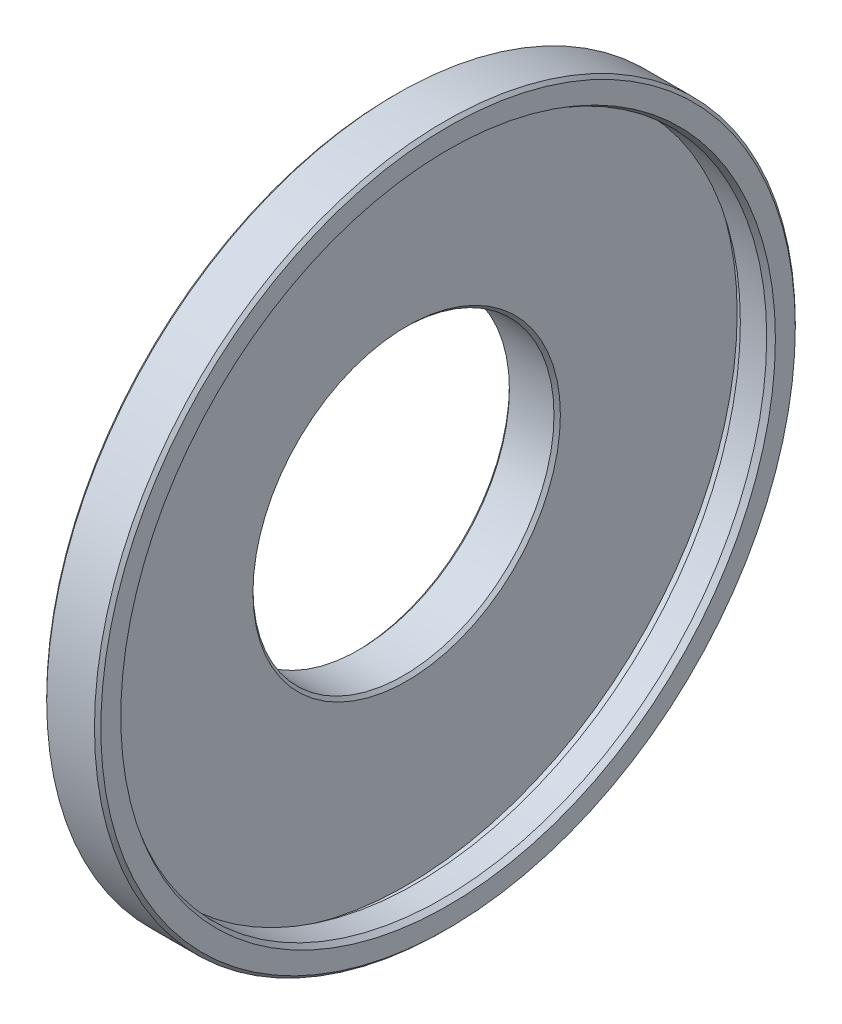
ISO-10303-21;
HEADER;
FILE_DESCRIPTION(('STEP AP214'),'2;1');
FILE_NAME('part.step','',(''),(''),'','','');
FILE_SCHEMA(('AUTOMOTIVE_DESIGN { 1 0 10303 214 1 1 1 1 }'));
ENDSEC;
DATA;
#1=APPLICATION_CONTEXT('core data for automotive mechanical design processes');
#2=APPLICATION_PROTOCOL_DEFINITION('international standard','automotive_design',2000,#1);
#3=PRODUCT_CONTEXT('',#1,'mechanical');
#4=PRODUCT('Part','Part','',(#3));
#5=PRODUCT_RELATED_PRODUCT_CATEGORY('part','',(#4));
#6=PRODUCT_DEFINITION_FORMATION('','',#4);
#7=PRODUCT_DEFINITION_CONTEXT('part definition',#1,'design');
#8=PRODUCT_DEFINITION('design','',#6,#7);
#9=PRODUCT_DEFINITION_SHAPE('','',#8);
#10=(LENGTH_UNIT() NAMED_UNIT(*) SI_UNIT(.MILLI.,.METRE.));
#11=(NAMED_UNIT(*) PLANE_ANGLE_UNIT() SI_UNIT($,.RADIAN.));
#12=(NAMED_UNIT(*) SI_UNIT($,.STERADIAN.) SOLID_ANGLE_UNIT());
#13=UNCERTAINTY_MEASURE_WITH_UNIT(LENGTH_MEASURE(1.E-05),#10,'distance_accuracy_value','');
#14=(GEOMETRIC_REPRESENTATION_CONTEXT(3) GLOBAL_UNCERTAINTY_ASSIGNED_CONTEXT((#13)) GLOBAL_UNIT_ASSIGNED_CONTEXT((#10,
#11,#12)) REPRESENTATION_CONTEXT('',''));
#15=CARTESIAN_POINT('',(0.,0.,0.));
#16=DIRECTION('',(0.,0.,1.));
#17=DIRECTION('',(1.,0.,0.));
#18=AXIS2_PLACEMENT_3D('',#15,#16,#17);
#19=CARTESIAN_POINT('',(0.,27.94,0.));
#20=DIRECTION('',(1.,0.,0.));
#21=DIRECTION('',(0.,0.,-1.));
#22=AXIS2_PLACEMENT_3D('',#19,#20,#21);
#23=PLANE('',#22);
#24=CARTESIAN_POINT('',(0.,0.,0.));
#25=DIRECTION('',(1.,0.,0.));
#26=DIRECTION('',(0.,0.,-1.));
#27=AXIS2_PLACEMENT_3D('',#24,#25,#26);
#28=CIRCLE('',#27,27.686);
#29=CARTESIAN_POINT('',(0.,0.,-27.686));
#30=VERTEX_POINT('',#29);
#31=EDGE_CURVE('E37',#30,#30,#28,.T.);
#32=ORIENTED_EDGE('',*,*,#31,.T.);
#33=EDGE_LOOP('',(#32));
#34=FACE_BOUND('',#33,.T.);
#35=CARTESIAN_POINT('',(0.,0.,0.));
#36=DIRECTION('',(1.,0.,0.));
#37=DIRECTION('',(0.,0.,-1.));
#38=AXIS2_PLACEMENT_3D('',#35,#36,#37);
#39=CIRCLE('',#38,26.0985);
#40=CARTESIAN_POINT('',(0.,0.,-26.0985));
#41=VERTEX_POINT('',#40);
#42=EDGE_CURVE('E49',#41,#41,#39,.F.);
#43=ORIENTED_EDGE('',*,*,#42,.T.);
#44=EDGE_LOOP('',(#43));
#45=FACE_BOUND('',#44,.T.);
#46=ADVANCED_FACE('F17',(#34,#45),#23,.T.);
#47=CARTESIAN_POINT('',(0.,0.,0.));
#48=DIRECTION('',(1.,0.,0.));
#49=DIRECTION('',(0.,0.,-1.));
#50=AXIS2_PLACEMENT_3D('',#47,#48,#49);
#51=CYLINDRICAL_SURFACE('',#50,27.94);
#52=CARTESIAN_POINT('',(-0.254000000000001,0.,0.));
#53=DIRECTION('',(1.,0.,0.));
#54=DIRECTION('',(0.,0.,-1.));
#55=AXIS2_PLACEMENT_3D('',#52,#53,#54);
#56=CIRCLE('',#55,27.94);
#57=CARTESIAN_POINT('',(-0.254000000000001,0.,-27.94));
#58=VERTEX_POINT('',#57);
#59=EDGE_CURVE('E28',#58,#58,#56,.F.);
#60=ORIENTED_EDGE('',*,*,#59,.T.);
#61=EDGE_LOOP('',(#60));
#62=FACE_BOUND('',#61,.T.);
#63=CARTESIAN_POINT('',(-4.064,0.,0.));
#64=DIRECTION('',(-1.,0.,0.));
#65=DIRECTION('',(0.,0.,1.));
#66=AXIS2_PLACEMENT_3D('',#63,#64,#65);
#67=CIRCLE('',#66,27.94);
#68=CARTESIAN_POINT('',(-4.064,0.,27.94));
#69=VERTEX_POINT('',#68);
#70=EDGE_CURVE('E32',#69,#69,#67,.F.);
#71=ORIENTED_EDGE('',*,*,#70,.T.);
#72=EDGE_LOOP('',(#71));
#73=FACE_BOUND('',#72,.T.);
#74=ADVANCED_FACE('F99',(#62,#73),#51,.T.);
#75=CARTESIAN_POINT('',(-4.318,27.94,0.));
#76=DIRECTION('',(-1.,0.,0.));
#77=DIRECTION('',(0.,0.,1.));
#78=AXIS2_PLACEMENT_3D('',#75,#76,#77);
#79=PLANE('',#78);
#80=CARTESIAN_POINT('',(-4.318,0.,0.));
#81=DIRECTION('',(-1.,0.,0.));
#82=DIRECTION('',(0.,0.,1.));
#83=AXIS2_PLACEMENT_3D('',#80,#81,#82);
#84=CIRCLE('',#83,27.686);
#85=CARTESIAN_POINT('',(-4.318,0.,27.686));
#86=VERTEX_POINT('',#85);
#87=EDGE_CURVE('E24',#86,#86,#84,.T.);
#88=ORIENTED_EDGE('',*,*,#87,.T.);
#89=EDGE_LOOP('',(#88));
#90=FACE_BOUND('',#89,.T.);
#91=CARTESIAN_POINT('',(-4.318,0.,0.));
#92=DIRECTION('',(1.,0.,0.));
#93=DIRECTION('',(0.,0.,-1.));
#94=AXIS2_PLACEMENT_3D('',#91,#92,#93);
#95=CIRCLE('',#94,12.6873);
#96=CARTESIAN_POINT('',(-4.318,0.,-12.6873));
#97=VERTEX_POINT('',#96);
#98=EDGE_CURVE('E61',#97,#97,#95,.T.);
#99=ORIENTED_EDGE('',*,*,#98,.T.);
#100=EDGE_LOOP('',(#99));
#101=FACE_BOUND('',#100,.T.);
#102=ADVANCED_FACE('F105',(#90,#101),#79,.T.);
#103=CARTESIAN_POINT('',(0.,0.,0.));
#104=DIRECTION('',(1.,0.,0.));
#105=DIRECTION('',(0.,0.,-1.));
#106=AXIS2_PLACEMENT_3D('',#103,#104,#105);
#107=CYLINDRICAL_SURFACE('',#106,12.6873);
#108=CARTESIAN_POINT('',(-5.08,0.,0.));
#109=DIRECTION('',(1.,0.,0.));
#110=DIRECTION('',(0.,0.,-1.));
#111=AXIS2_PLACEMENT_3D('',#108,#109,#110);
#112=CIRCLE('',#111,12.6873);
#113=CARTESIAN_POINT('',(-5.08,0.,-12.6873));
#114=VERTEX_POINT('',#113);
#115=EDGE_CURVE('E64',#114,#114,#112,.T.);
#116=ORIENTED_EDGE('',*,*,#115,.T.);
#117=EDGE_LOOP('',(#116));
#118=FACE_BOUND('',#117,.T.);
#119=ORIENTED_EDGE('',*,*,#98,.F.);
#120=EDGE_LOOP('',(#119));
#121=FACE_BOUND('',#120,.T.);
#122=ADVANCED_FACE('F158',(#118,#121),#107,.T.);
#123=CARTESIAN_POINT('',(-5.08,0.,0.));
#124=DIRECTION('',(-1.,0.,0.));
#125=DIRECTION('',(0.,0.,1.));
#126=AXIS2_PLACEMENT_3D('',#123,#124,#125);
#127=CONICAL_SURFACE('',#126,12.6873,1.0471975511966);
#128=CARTESIAN_POINT('',(-5.34396454307349,0.,0.));
#129=DIRECTION('',(1.,0.,0.));
#130=DIRECTION('',(0.,0.,-1.));
#131=AXIS2_PLACEMENT_3D('',#128,#129,#130);
#132=CIRCLE('',#131,13.1445);
#133=CARTESIAN_POINT('',(-5.34396454307349,0.,-13.1445));
#134=VERTEX_POINT('',#133);
#135=EDGE_CURVE('E67',#134,#134,#132,.T.);
#136=ORIENTED_EDGE('',*,*,#135,.T.);
#137=EDGE_LOOP('',(#136));
#138=FACE_BOUND('',#137,.T.);
#139=ORIENTED_EDGE('',*,*,#115,.F.);
#140=EDGE_LOOP('',(#139));
#141=FACE_BOUND('',#140,.T.);
#142=ADVANCED_FACE('F154',(#138,#141),#127,.T.);
#143=CARTESIAN_POINT('',(0.,0.,0.));
#144=DIRECTION('',(1.,0.,0.));
#145=DIRECTION('',(0.,0.,-1.));
#146=AXIS2_PLACEMENT_3D('',#143,#144,#145);
#147=CYLINDRICAL_SURFACE('',#146,13.1445);
#148=CARTESIAN_POINT('',(-6.92605909487752,0.,0.));
#149=DIRECTION('',(-1.,0.,0.));
#150=DIRECTION('',(0.,0.,1.));
#151=AXIS2_PLACEMENT_3D('',#148,#149,#150);
#152=CIRCLE('',#151,13.1445);
#153=CARTESIAN_POINT('',(-6.92605909487752,0.,-13.1445));
#154=VERTEX_POINT('',#153);
#155=EDGE_CURVE('E58',#154,#154,#152,.F.);
#156=ORIENTED_EDGE('',*,*,#155,.T.);
#157=EDGE_LOOP('',(#156));
#158=FACE_BOUND('',#157,.T.);
#159=ORIENTED_EDGE('',*,*,#135,.F.);
#160=EDGE_LOOP('',(#159));
#161=FACE_BOUND('',#160,.T.);
#162=ADVANCED_FACE('F148',(#158,#161),#147,.T.);
#163=CARTESIAN_POINT('',(-7.366,13.1445,0.));
#164=DIRECTION('',(-1.,0.,0.));
#165=DIRECTION('',(0.,0.,1.));
#166=AXIS2_PLACEMENT_3D('',#163,#164,#165);
#167=PLANE('',#166);
#168=CARTESIAN_POINT('',(-7.366,0.,0.));
#169=DIRECTION('',(-1.,0.,0.));
#170=DIRECTION('',(0.,0.,1.));
#171=AXIS2_PLACEMENT_3D('',#168,#169,#170);
#172=CIRCLE('',#171,12.2555);
#173=CARTESIAN_POINT('',(-7.366,0.,12.2555));
#174=VERTEX_POINT('',#173);
#175=EDGE_CURVE('E10',#174,#174,#172,.F.);
#176=ORIENTED_EDGE('',*,*,#175,.T.);
#177=EDGE_LOOP('',(#176));
#178=FACE_BOUND('',#177,.T.);
#179=CARTESIAN_POINT('',(-7.366,0.,0.));
#180=DIRECTION('',(-1.,0.,0.));
#181=DIRECTION('',(0.,0.,1.));
#182=AXIS2_PLACEMENT_3D('',#179,#180,#181);
#183=CIRCLE('',#182,12.8905);
#184=CARTESIAN_POINT('',(-7.366,0.,-12.8905));
#185=VERTEX_POINT('',#184);
#186=EDGE_CURVE('E55',#185,#185,#183,.T.);
#187=ORIENTED_EDGE('',*,*,#186,.T.);
#188=EDGE_LOOP('',(#187));
#189=FACE_BOUND('',#188,.T.);
#190=ADVANCED_FACE('F139',(#178,#189),#167,.T.);
#191=CARTESIAN_POINT('',(0.,0.,0.));
#192=DIRECTION('',(1.,0.,0.));
#193=DIRECTION('',(0.,0.,-1.));
#194=AXIS2_PLACEMENT_3D('',#191,#192,#193);
#195=CYLINDRICAL_SURFACE('',#194,12.0015);
#196=CARTESIAN_POINT('',(-3.556,0.,0.));
#197=DIRECTION('',(1.,0.,0.));
#198=DIRECTION('',(0.,0.,-1.));
#199=AXIS2_PLACEMENT_3D('',#196,#197,#198);
#200=CIRCLE('',#199,12.0015);
#201=CARTESIAN_POINT('',(-3.556,0.,-12.0015));
#202=VERTEX_POINT('',#201);
#203=EDGE_CURVE('E43',#202,#202,#200,.T.);
#204=ORIENTED_EDGE('',*,*,#203,.T.);
#205=EDGE_LOOP('',(#204));
#206=FACE_BOUND('',#205,.T.);
#207=CARTESIAN_POINT('',(-7.11199999999999,0.,0.));
#208=DIRECTION('',(-1.,0.,0.));
#209=DIRECTION('',(0.,0.,1.));
#210=AXIS2_PLACEMENT_3D('',#207,#208,#209);
#211=CIRCLE('',#210,12.0015);
#212=CARTESIAN_POINT('',(-7.11199999999999,0.,12.0015));
#213=VERTEX_POINT('',#212);
#214=EDGE_CURVE('E46',#213,#213,#211,.T.);
#215=ORIENTED_EDGE('',*,*,#214,.T.);
#216=EDGE_LOOP('',(#215));
#217=FACE_BOUND('',#216,.T.);
#218=ADVANCED_FACE('F136',(#206,#217),#195,.F.);
#219=CARTESIAN_POINT('',(-3.302,12.0015,0.));
#220=DIRECTION('',(1.,0.,0.));
#221=DIRECTION('',(0.,0.,-1.));
#222=AXIS2_PLACEMENT_3D('',#219,#220,#221);
#223=PLANE('',#222);
#224=CARTESIAN_POINT('',(-3.302,0.,0.));
#225=DIRECTION('',(1.,0.,0.));
#226=DIRECTION('',(0.,0.,-1.));
#227=AXIS2_PLACEMENT_3D('',#224,#225,#226);
#228=CIRCLE('',#227,12.2555);
#229=CARTESIAN_POINT('',(-3.302,0.,-12.2555));
#230=VERTEX_POINT('',#229);
#231=EDGE_CURVE('E40',#230,#230,#228,.F.);
#232=ORIENTED_EDGE('',*,*,#231,.T.);
#233=EDGE_LOOP('',(#232));
#234=FACE_BOUND('',#233,.T.);
#235=CARTESIAN_POINT('',(-3.302,0.,0.));
#236=DIRECTION('',(1.,0.,0.));
#237=DIRECTION('',(0.,0.,-1.));
#238=AXIS2_PLACEMENT_3D('',#235,#236,#237);
#239=CIRCLE('',#238,26.3525);
#240=CARTESIAN_POINT('',(-3.302,0.,-26.3525));
#241=VERTEX_POINT('',#240);
#242=EDGE_CURVE('E70',#241,#241,#239,.T.);
#243=ORIENTED_EDGE('',*,*,#242,.T.);
#244=EDGE_LOOP('',(#243));
#245=FACE_BOUND('',#244,.T.);
#246=ADVANCED_FACE('F138',(#234,#245),#223,.T.);
#247=CARTESIAN_POINT('',(0.,0.,0.));
#248=DIRECTION('',(1.,0.,0.));
#249=DIRECTION('',(0.,0.,-1.));
#250=AXIS2_PLACEMENT_3D('',#247,#248,#249);
#251=CYLINDRICAL_SURFACE('',#250,26.3525);
#252=CARTESIAN_POINT('',(-2.54,0.,0.));
#253=DIRECTION('',(1.,0.,0.));
#254=DIRECTION('',(0.,0.,-1.));
#255=AXIS2_PLACEMENT_3D('',#252,#253,#254);
#256=CIRCLE('',#255,26.3525);
#257=CARTESIAN_POINT('',(-2.54,0.,-26.3525));
#258=VERTEX_POINT('',#257);
#259=EDGE_CURVE('E73',#258,#258,#256,.T.);
#260=ORIENTED_EDGE('',*,*,#259,.T.);
#261=EDGE_LOOP('',(#260));
#262=FACE_BOUND('',#261,.T.);
#263=ORIENTED_EDGE('',*,*,#242,.F.);
#264=EDGE_LOOP('',(#263));
#265=FACE_BOUND('',#264,.T.);
#266=ADVANCED_FACE('F96',(#262,#265),#251,.F.);
#267=CARTESIAN_POINT('',(-2.54,26.3525,0.));
#268=DIRECTION('',(-1.,0.,0.));
#269=DIRECTION('',(0.,0.,1.));
#270=AXIS2_PLACEMENT_3D('',#267,#268,#269);
#271=PLANE('',#270);
#272=CARTESIAN_POINT('',(-2.54,0.,0.));
#273=DIRECTION('',(1.,0.,0.));
#274=DIRECTION('',(0.,0.,-1.));
#275=AXIS2_PLACEMENT_3D('',#272,#273,#274);
#276=CIRCLE('',#275,25.8445);
#277=CARTESIAN_POINT('',(-2.54,0.,-25.8445));
#278=VERTEX_POINT('',#277);
#279=EDGE_CURVE('E76',#278,#278,#276,.T.);
#280=ORIENTED_EDGE('',*,*,#279,.T.);
#281=EDGE_LOOP('',(#280));
#282=FACE_BOUND('',#281,.T.);
#283=ORIENTED_EDGE('',*,*,#259,.F.);
#284=EDGE_LOOP('',(#283));
#285=FACE_BOUND('',#284,.T.);
#286=ADVANCED_FACE('F80',(#282,#285),#271,.T.);
#287=CARTESIAN_POINT('',(0.,0.,0.));
#288=DIRECTION('',(1.,0.,0.));
#289=DIRECTION('',(0.,0.,-1.));
#290=AXIS2_PLACEMENT_3D('',#287,#288,#289);
#291=CYLINDRICAL_SURFACE('',#290,25.8445);
#292=CARTESIAN_POINT('',(-0.439940905122456,0.,0.));
#293=DIRECTION('',(1.,0.,0.));
#294=DIRECTION('',(0.,0.,-1.));
#295=AXIS2_PLACEMENT_3D('',#292,#293,#294);
#296=CIRCLE('',#295,25.8445);
#297=CARTESIAN_POINT('',(-0.439940905122456,0.,-25.8445));
#298=VERTEX_POINT('',#297);
#299=EDGE_CURVE('E52',#298,#298,#296,.T.);
#300=ORIENTED_EDGE('',*,*,#299,.T.);
#301=EDGE_LOOP('',(#300));
#302=FACE_BOUND('',#301,.T.);
#303=ORIENTED_EDGE('',*,*,#279,.F.);
#304=EDGE_LOOP('',(#303));
#305=FACE_BOUND('',#304,.T.);
#306=ADVANCED_FACE('F83',(#302,#305),#291,.F.);
#307=CARTESIAN_POINT('',(-6.92605909487752,0.,0.));
#308=DIRECTION('',(1.,0.,0.));
#309=DIRECTION('',(0.,0.,-1.));
#310=AXIS2_PLACEMENT_3D('',#307,#308,#309);
#311=CONICAL_SURFACE('',#310,13.1445,0.523598775598309);
#312=CARTESIAN_POINT('',(-7.366,0.,-12.8905));
#313=CARTESIAN_POINT('',(-7.36141728223831,0.,-12.8931458333333));
#314=CARTESIAN_POINT('',(-7.35683456447662,0.,-12.8957916666667));
#315=CARTESIAN_POINT('',(-7.34766912895323,0.,-12.9010833333333));
#316=CARTESIAN_POINT('',(-7.34308641119154,0.,-12.9037291666667));
#317=CARTESIAN_POINT('',(-7.33392097566815,0.,-12.9090208333333));
#318=CARTESIAN_POINT('',(-7.32933825790646,0.,-12.9116666666667));
#319=CARTESIAN_POINT('',(-7.32017282238308,0.,-12.9169583333333));
#320=CARTESIAN_POINT('',(-7.31559010462138,0.,-12.9196041666667));
#321=CARTESIAN_POINT('',(-7.306424669098,0.,-12.9248958333333));
#322=CARTESIAN_POINT('',(-7.30184195133631,0.,-12.9275416666667));
#323=CARTESIAN_POINT('',(-7.29267651581292,0.,-12.9328333333333));
#324=CARTESIAN_POINT('',(-7.28809379805123,0.,-12.9354791666667));
#325=CARTESIAN_POINT('',(-7.27892836252784,0.,-12.9407708333333));
#326=CARTESIAN_POINT('',(-7.27434564476615,0.,-12.9434166666667));
#327=CARTESIAN_POINT('',(-7.26518020924277,0.,-12.9487083333333));
#328=CARTESIAN_POINT('',(-7.26059749148107,0.,-12.9513541666667));
#329=CARTESIAN_POINT('',(-7.25143205595769,0.,-12.9566458333333));
#330=CARTESIAN_POINT('',(-7.246849338196,0.,-12.9592916666667));
#331=CARTESIAN_POINT('',(-7.23768390267261,0.,-12.9645833333333));
#332=CARTESIAN_POINT('',(-7.23310118491092,0.,-12.9672291666667));
#333=CARTESIAN_POINT('',(-7.22393574938753,0.,-12.9725208333333));
#334=CARTESIAN_POINT('',(-7.21935303162584,0.,-12.9751666666667));
#335=CARTESIAN_POINT('',(-7.21018759610246,0.,-12.9804583333333));
#336=CARTESIAN_POINT('',(-7.20560487834076,0.,-12.9831041666667));
#337=CARTESIAN_POINT('',(-7.19643944281738,0.,-12.9883958333333));
#338=CARTESIAN_POINT('',(-7.19185672505569,0.,-12.9910416666667));
#339=CARTESIAN_POINT('',(-7.1826912895323,0.,-12.9963333333333));
#340=CARTESIAN_POINT('',(-7.17810857177061,0.,-12.9989791666667));
#341=CARTESIAN_POINT('',(-7.16894313624722,0.,-13.0042708333333));
#342=CARTESIAN_POINT('',(-7.16436041848553,0.,-13.0069166666667));
#343=CARTESIAN_POINT('',(-7.15519498296215,0.,-13.0122083333333));
#344=CARTESIAN_POINT('',(-7.15061226520045,0.,-13.0148541666667));
#345=CARTESIAN_POINT('',(-7.14144682967707,0.,-13.0201458333333));
#346=CARTESIAN_POINT('',(-7.13686411191538,0.,-13.0227916666667));
#347=CARTESIAN_POINT('',(-7.12769867639199,0.,-13.0280833333333));
#348=CARTESIAN_POINT('',(-7.1231159586303,0.,-13.0307291666667));
#349=CARTESIAN_POINT('',(-7.11395052310691,0.,-13.0360208333333));
#350=CARTESIAN_POINT('',(-7.10936780534522,0.,-13.0386666666667));
#351=CARTESIAN_POINT('',(-7.10020236982184,0.,-13.0439583333333));
#352=CARTESIAN_POINT('',(-7.09561965206014,0.,-13.0466041666667));
#353=CARTESIAN_POINT('',(-7.08645421653676,0.,-13.0518958333333));
#354=CARTESIAN_POINT('',(-7.08187149877507,0.,-13.0545416666667));
#355=CARTESIAN_POINT('',(-7.07270606325168,0.,-13.0598333333333));
#356=CARTESIAN_POINT('',(-7.06812334548999,0.,-13.0624791666667));
#357=CARTESIAN_POINT('',(-7.0589579099666,0.,-13.0677708333333));
#358=CARTESIAN_POINT('',(-7.05437519220491,0.,-13.0704166666667));
#359=CARTESIAN_POINT('',(-7.04520975668153,0.,-13.0757083333333));
#360=CARTESIAN_POINT('',(-7.04062703891983,0.,-13.0783541666667));
#361=CARTESIAN_POINT('',(-7.03146160339645,0.,-13.0836458333333));
#362=CARTESIAN_POINT('',(-7.02687888563476,0.,-13.0862916666667));
#363=CARTESIAN_POINT('',(-7.01771345011137,0.,-13.0915833333333));
#364=CARTESIAN_POINT('',(-7.01313073234968,0.,-13.0942291666667));
#365=CARTESIAN_POINT('',(-7.00396529682629,0.,-13.0995208333333));
#366=CARTESIAN_POINT('',(-6.9993825790646,0.,-13.1021666666667));
#367=CARTESIAN_POINT('',(-6.99021714354122,0.,-13.1074583333333));
#368=CARTESIAN_POINT('',(-6.98563442577952,0.,-13.1101041666667));
#369=CARTESIAN_POINT('',(-6.97646899025614,0.,-13.1153958333333));
#370=CARTESIAN_POINT('',(-6.97188627249445,0.,-13.1180416666667));
#371=CARTESIAN_POINT('',(-6.96272083697106,0.,-13.1233333333333));
#372=CARTESIAN_POINT('',(-6.95813811920937,0.,-13.1259791666667));
#373=CARTESIAN_POINT('',(-6.94897268368598,0.,-13.1312708333333));
#374=CARTESIAN_POINT('',(-6.94438996592429,0.,-13.1339166666667));
#375=CARTESIAN_POINT('',(-6.93522453040091,0.,-13.1392083333333));
#376=CARTESIAN_POINT('',(-6.93064181263921,0.,-13.1418541666667));
#377=CARTESIAN_POINT('',(-6.92605909487752,0.,-13.1445));
#378=B_SPLINE_CURVE_WITH_KNOTS('',3,(#312,#313,#314,#315,#316,#317,#318,#319,#320,#321,#322,
#323,#324,#325,#326,#327,#328,#329,#330,#331,#332,#333,#334,#335,#336,#337,#338,#339,#340,#341,
#342,#343,#344,#345,#346,#347,#348,#349,#350,#351,#352,#353,#354,#355,#356,#357,#358,#359,#360,
#361,#362,#363,#364,#365,#366,#367,#368,#369,#370,#371,#372,#373,#374,#375,#376,#377),
.UNSPECIFIED.,.F.,.F.,(4,2,2,2,2,2,2,2,2,2,2,2,2,2,2,2,2,2,2,2,2,2,2,2,2,2,2,2,2,2,2,2,4),(0.,
0.0158749999999999,0.0317499999999999,0.047624999999999,0.063499999999999,0.0793749999999982,
0.0952499999999973,0.111124999999997,0.126999999999996,0.142874999999996,0.158749999999996,
0.174624999999996,0.190499999999996,0.206374999999995,0.222249999999994,0.238124999999994,
0.253999999999993,0.269874999999993,0.285749999999993,0.301624999999992,0.317499999999992,
0.333374999999991,0.34924999999999,0.36512499999999,0.38099999999999,0.39687499999999,
0.412749999999989,0.428624999999988,0.444499999999988,0.460374999999987,0.476249999999987,
0.492124999999987,0.507999999999986),.UNSPECIFIED.);
#379=EDGE_CURVE('BSEAM85',#185,#154,#378,.T.);
#380=ORIENTED_EDGE('',*,*,#186,.F.);
#381=ORIENTED_EDGE('',*,*,#155,.F.);
#382=ORIENTED_EDGE('',*,*,#379,.T.);
#383=ORIENTED_EDGE('',*,*,#379,.F.);
#384=EDGE_LOOP('',(#380,#382,#381,#383));
#385=FACE_BOUND('',#384,.T.);
#386=ADVANCED_FACE('F85',(#385),#311,.T.);
#387=CARTESIAN_POINT('',(-0.439940905122456,0.,0.));
#388=DIRECTION('',(1.,0.,0.));
#389=DIRECTION('',(0.,0.,-1.));
#390=AXIS2_PLACEMENT_3D('',#387,#388,#389);
#391=CONICAL_SURFACE('',#390,25.8445,0.523598775598297);
#392=CARTESIAN_POINT('',(0.,0.,-26.0985));
#393=CARTESIAN_POINT('',(-0.00458271776169268,0.,-26.0958541666666));
#394=CARTESIAN_POINT('',(-0.00916543552338493,0.,-26.0932083333333));
#395=CARTESIAN_POINT('',(-0.0183308710467694,0.,-26.0879166666666));
#396=CARTESIAN_POINT('',(-0.0229135888084617,0.,-26.0852708333333));
#397=CARTESIAN_POINT('',(-0.0320790243318462,0.,-26.0799791666666));
#398=CARTESIAN_POINT('',(-0.0366617420935384,0.,-26.0773333333333));
#399=CARTESIAN_POINT('',(-0.0458271776169229,0.,-26.0720416666666));
#400=CARTESIAN_POINT('',(-0.0504098953786152,0.,-26.0693958333333));
#401=CARTESIAN_POINT('',(-0.0595753309019997,0.,-26.0641041666666));
#402=CARTESIAN_POINT('',(-0.0641580486636919,0.,-26.0614583333333));
#403=CARTESIAN_POINT('',(-0.0733234841870764,0.,-26.0561666666666));
#404=CARTESIAN_POINT('',(-0.0779062019487687,0.,-26.0535208333333));
#405=CARTESIAN_POINT('',(-0.0870716374721532,0.,-26.0482291666666));
#406=CARTESIAN_POINT('',(-0.0916543552338454,0.,-26.0455833333333));
#407=CARTESIAN_POINT('',(-0.10081979075723,0.,-26.0402916666667));
#408=CARTESIAN_POINT('',(-0.105402508518922,0.,-26.0376458333333));
#409=CARTESIAN_POINT('',(-0.114567944042307,0.,-26.0323541666667));
#410=CARTESIAN_POINT('',(-0.119150661803999,0.,-26.0297083333333));
#411=CARTESIAN_POINT('',(-0.128316097327383,0.,-26.0244166666666));
#412=CARTESIAN_POINT('',(-0.132898815089076,0.,-26.0217708333333));
#413=CARTESIAN_POINT('',(-0.14206425061246,0.,-26.0164791666667));
#414=CARTESIAN_POINT('',(-0.146646968374152,0.,-26.0138333333333));
#415=CARTESIAN_POINT('',(-0.155812403897537,0.,-26.0085416666667));
#416=CARTESIAN_POINT('',(-0.160395121659229,0.,-26.0058958333333));
#417=CARTESIAN_POINT('',(-0.169560557182614,0.,-26.0006041666667));
#418=CARTESIAN_POINT('',(-0.174143274944306,0.,-25.9979583333333));
#419=CARTESIAN_POINT('',(-0.18330871046769,0.,-25.9926666666667));
#420=CARTESIAN_POINT('',(-0.187891428229383,0.,-25.9900208333333));
#421=CARTESIAN_POINT('',(-0.197056863752767,0.,-25.9847291666667));
#422=CARTESIAN_POINT('',(-0.201639581514459,0.,-25.9820833333333));
#423=CARTESIAN_POINT('',(-0.210805017037844,0.,-25.9767916666667));
#424=CARTESIAN_POINT('',(-0.215387734799536,0.,-25.9741458333333));
#425=CARTESIAN_POINT('',(-0.224553170322921,0.,-25.9688541666667));
#426=CARTESIAN_POINT('',(-0.229135888084613,0.,-25.9662083333333));
#427=CARTESIAN_POINT('',(-0.238301323607997,0.,-25.9609166666667));
#428=CARTESIAN_POINT('',(-0.24288404136969,0.,-25.9582708333333));
#429=CARTESIAN_POINT('',(-0.252049476893074,0.,-25.9529791666667));
#430=CARTESIAN_POINT('',(-0.256632194654766,0.,-25.9503333333333));
#431=CARTESIAN_POINT('',(-0.265797630178151,0.,-25.9450416666667));
#432=CARTESIAN_POINT('',(-0.270380347939843,0.,-25.9423958333333));
#433=CARTESIAN_POINT('',(-0.279545783463228,0.,-25.9371041666667));
#434=CARTESIAN_POINT('',(-0.28412850122492,0.,-25.9344583333333));
#435=CARTESIAN_POINT('',(-0.293293936748304,0.,-25.9291666666667));
#436=CARTESIAN_POINT('',(-0.297876654509997,0.,-25.9265208333333));
#437=CARTESIAN_POINT('',(-0.307042090033381,0.,-25.9212291666667));
#438=CARTESIAN_POINT('',(-0.311624807795073,0.,-25.9185833333333));
#439=CARTESIAN_POINT('',(-0.320790243318458,0.,-25.9132916666667));
#440=CARTESIAN_POINT('',(-0.32537296108015,0.,-25.9106458333333));
#441=CARTESIAN_POINT('',(-0.334538396603535,0.,-25.9053541666667));
#442=CARTESIAN_POINT('',(-0.339121114365227,0.,-25.9027083333333));
#443=CARTESIAN_POINT('',(-0.348286549888611,0.,-25.8974166666667));
#444=CARTESIAN_POINT('',(-0.352869267650304,0.,-25.8947708333333));
#445=CARTESIAN_POINT('',(-0.362034703173688,0.,-25.8894791666667));
#446=CARTESIAN_POINT('',(-0.36661742093538,0.,-25.8868333333333));
#447=CARTESIAN_POINT('',(-0.375782856458765,0.,-25.8815416666667));
#448=CARTESIAN_POINT('',(-0.380365574220457,0.,-25.8788958333333));
#449=CARTESIAN_POINT('',(-0.389531009743842,0.,-25.8736041666667));
#450=CARTESIAN_POINT('',(-0.394113727505534,0.,-25.8709583333333));
#451=CARTESIAN_POINT('',(-0.403279163028918,0.,-25.8656666666667));
#452=CARTESIAN_POINT('',(-0.407861880790611,0.,-25.8630208333333));
#453=CARTESIAN_POINT('',(-0.417027316313995,0.,-25.8577291666667));
#454=CARTESIAN_POINT('',(-0.421610034075687,0.,-25.8550833333333));
#455=CARTESIAN_POINT('',(-0.430775469599072,0.,-25.8497916666667));
#456=CARTESIAN_POINT('',(-0.435358187360764,0.,-25.8471458333333));
#457=CARTESIAN_POINT('',(-0.439940905122456,0.,-25.8445));
#458=B_SPLINE_CURVE_WITH_KNOTS('',3,(#392,#393,#394,#395,#396,#397,#398,#399,#400,#401,#402,
#403,#404,#405,#406,#407,#408,#409,#410,#411,#412,#413,#414,#415,#416,#417,#418,#419,#420,#421,
#422,#423,#424,#425,#426,#427,#428,#429,#430,#431,#432,#433,#434,#435,#436,#437,#438,#439,#440,
#441,#442,#443,#444,#445,#446,#447,#448,#449,#450,#451,#452,#453,#454,#455,#456,#457),
.UNSPECIFIED.,.F.,.F.,(4,2,2,2,2,2,2,2,2,2,2,2,2,2,2,2,2,2,2,2,2,2,2,2,2,2,2,2,2,2,2,2,4),(0.,
0.0158749999999986,0.0317499999999972,0.0476249999999957,0.0634999999999943,0.0793749999999929,
0.0952499999999915,0.11112499999999,0.126999999999989,0.142874999999987,0.158749999999986,
0.174624999999984,0.190499999999983,0.206374999999982,0.22224999999998,0.238124999999979,
0.253999999999977,0.269874999999976,0.285749999999974,0.301624999999973,0.317499999999972,
0.33337499999997,0.349249999999969,0.365124999999967,0.380999999999966,0.396874999999965,
0.412749999999963,0.428624999999962,0.44449999999996,0.460374999999959,0.476249999999957,
0.492124999999956,0.507999999999955),.UNSPECIFIED.);
#459=EDGE_CURVE('BSEAM93',#41,#298,#458,.T.);
#460=ORIENTED_EDGE('',*,*,#42,.F.);
#461=ORIENTED_EDGE('',*,*,#299,.F.);
#462=ORIENTED_EDGE('',*,*,#459,.T.);
#463=ORIENTED_EDGE('',*,*,#459,.F.);
#464=EDGE_LOOP('',(#460,#462,#461,#463));
#465=FACE_BOUND('',#464,.T.);
#466=ADVANCED_FACE('F93',(#465),#391,.F.);
#467=CARTESIAN_POINT('',(-3.556,0.,0.));
#468=DIRECTION('',(1.,0.,0.));
#469=DIRECTION('',(0.,0.,-1.));
#470=AXIS2_PLACEMENT_3D('',#467,#468,#469);
#471=CONICAL_SURFACE('',#470,12.0015,0.785398163397448);
#472=ORIENTED_EDGE('',*,*,#231,.F.);
#473=EDGE_LOOP('',(#472));
#474=FACE_BOUND('',#473,.T.);
#475=ORIENTED_EDGE('',*,*,#203,.F.);
#476=EDGE_LOOP('',(#475));
#477=FACE_BOUND('',#476,.T.);
#478=ADVANCED_FACE('F113',(#474,#477),#471,.F.);
#479=CARTESIAN_POINT('',(0.,0.,0.));
#480=DIRECTION('',(-1.,0.,0.));
#481=DIRECTION('',(0.,0.,1.));
#482=AXIS2_PLACEMENT_3D('',#479,#480,#481);
#483=CONICAL_SURFACE('',#482,27.686,0.785398163397448);
#484=ORIENTED_EDGE('',*,*,#59,.F.);
#485=EDGE_LOOP('',(#484));
#486=FACE_BOUND('',#485,.T.);
#487=ORIENTED_EDGE('',*,*,#31,.F.);
#488=EDGE_LOOP('',(#487));
#489=FACE_BOUND('',#488,.T.);
#490=ADVANCED_FACE('F117',(#486,#489),#483,.T.);
#491=CARTESIAN_POINT('',(-4.064,0.,0.));
#492=DIRECTION('',(1.,0.,0.));
#493=DIRECTION('',(0.,0.,-1.));
#494=AXIS2_PLACEMENT_3D('',#491,#492,#493);
#495=CONICAL_SURFACE('',#494,27.94,0.785398163397448);
#496=ORIENTED_EDGE('',*,*,#87,.F.);
#497=EDGE_LOOP('',(#496));
#498=FACE_BOUND('',#497,.T.);
#499=ORIENTED_EDGE('',*,*,#70,.F.);
#500=EDGE_LOOP('',(#499));
#501=FACE_BOUND('',#500,.T.);
#502=ADVANCED_FACE('F120',(#498,#501),#495,.T.);
#503=CARTESIAN_POINT('',(-7.366,0.,0.));
#504=DIRECTION('',(-1.,0.,0.));
#505=DIRECTION('',(0.,0.,1.));
#506=AXIS2_PLACEMENT_3D('',#503,#504,#505);
#507=CONICAL_SURFACE('',#506,12.2555,0.785398163397452);
#508=ORIENTED_EDGE('',*,*,#214,.F.);
#509=EDGE_LOOP('',(#508));
#510=FACE_BOUND('',#509,.T.);
#511=ORIENTED_EDGE('',*,*,#175,.F.);
#512=EDGE_LOOP('',(#511));
#513=FACE_BOUND('',#512,.T.);
#514=ADVANCED_FACE('F19',(#510,#513),#507,.F.);
#515=CLOSED_SHELL('',(#46,#74,#102,#122,#142,#162,#190,#218,#246,#266,#286,#306,#386,#466,#478,
#490,#502,#514));
#516=MANIFOLD_SOLID_BREP('B1',#515);
#517=ADVANCED_BREP_SHAPE_REPRESENTATION('',(#18,#516),#14);
#518=SHAPE_DEFINITION_REPRESENTATION(#9,#517);
ENDSEC;
END-ISO-10303-21;
